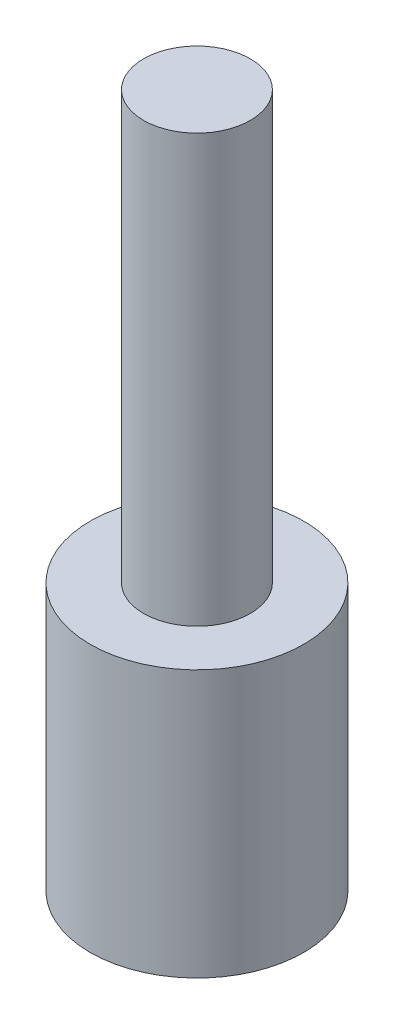
ISO-10303-21;
HEADER;
FILE_DESCRIPTION(('STEP AP214'),'2;1');
FILE_NAME('part.step','',(''),(''),'','','');
FILE_SCHEMA(('AUTOMOTIVE_DESIGN { 1 0 10303 214 1 1 1 1 }'));
ENDSEC;
DATA;
#1=APPLICATION_CONTEXT('core data for automotive mechanical design processes');
#2=APPLICATION_PROTOCOL_DEFINITION('international standard','automotive_design',2000,#1);
#3=PRODUCT_CONTEXT('',#1,'mechanical');
#4=PRODUCT('Part','Part','',(#3));
#5=PRODUCT_RELATED_PRODUCT_CATEGORY('part','',(#4));
#6=PRODUCT_DEFINITION_FORMATION('','',#4);
#7=PRODUCT_DEFINITION_CONTEXT('part definition',#1,'design');
#8=PRODUCT_DEFINITION('design','',#6,#7);
#9=PRODUCT_DEFINITION_SHAPE('','',#8);
#10=(LENGTH_UNIT() NAMED_UNIT(*) SI_UNIT(.MILLI.,.METRE.));
#11=(NAMED_UNIT(*) PLANE_ANGLE_UNIT() SI_UNIT($,.RADIAN.));
#12=(NAMED_UNIT(*) SI_UNIT($,.STERADIAN.) SOLID_ANGLE_UNIT());
#13=UNCERTAINTY_MEASURE_WITH_UNIT(LENGTH_MEASURE(1.E-05),#10,'distance_accuracy_value','');
#14=(GEOMETRIC_REPRESENTATION_CONTEXT(3) GLOBAL_UNCERTAINTY_ASSIGNED_CONTEXT((#13)) GLOBAL_UNIT_ASSIGNED_CONTEXT((#10,
#11,#12)) REPRESENTATION_CONTEXT('',''));
#15=CARTESIAN_POINT('',(0.,0.,0.));
#16=DIRECTION('',(0.,0.,1.));
#17=DIRECTION('',(1.,0.,0.));
#18=AXIS2_PLACEMENT_3D('',#15,#16,#17);
#19=CARTESIAN_POINT('',(0.,50.,0.));
#20=DIRECTION('',(0.,-1.,0.));
#21=DIRECTION('',(0.,0.,-1.));
#22=AXIS2_PLACEMENT_3D('',#19,#20,#21);
#23=CYLINDRICAL_SURFACE('',#22,20.);
#24=CARTESIAN_POINT('',(0.,50.,0.));
#25=DIRECTION('',(0.,1.,0.));
#26=DIRECTION('',(0.,0.,1.));
#27=AXIS2_PLACEMENT_3D('',#24,#25,#26);
#28=CIRCLE('',#27,20.);
#29=CARTESIAN_POINT('',(0.,50.,20.));
#30=VERTEX_POINT('',#29);
#31=EDGE_CURVE('E10',#30,#30,#28,.T.);
#32=ORIENTED_EDGE('',*,*,#31,.F.);
#33=EDGE_LOOP('',(#32));
#34=FACE_BOUND('',#33,.T.);
#35=CARTESIAN_POINT('',(0.,0.,0.));
#36=DIRECTION('',(0.,1.,0.));
#37=DIRECTION('',(0.,0.,1.));
#38=AXIS2_PLACEMENT_3D('',#35,#36,#37);
#39=CIRCLE('',#38,20.);
#40=CARTESIAN_POINT('',(0.,0.,20.));
#41=VERTEX_POINT('',#40);
#42=EDGE_CURVE('E34',#41,#41,#39,.T.);
#43=ORIENTED_EDGE('',*,*,#42,.T.);
#44=EDGE_LOOP('',(#43));
#45=FACE_BOUND('',#44,.T.);
#46=ADVANCED_FACE('F31',(#34,#45),#23,.T.);
#47=CARTESIAN_POINT('',(0.,50.,0.));
#48=DIRECTION('',(0.,1.,0.));
#49=DIRECTION('',(0.,0.,1.));
#50=AXIS2_PLACEMENT_3D('',#47,#48,#49);
#51=PLANE('',#50);
#52=CARTESIAN_POINT('',(0.,50.,0.));
#53=DIRECTION('',(0.,1.,0.));
#54=DIRECTION('',(0.,0.,1.));
#55=AXIS2_PLACEMENT_3D('',#52,#53,#54);
#56=CIRCLE('',#55,10.);
#57=CARTESIAN_POINT('',(0.,50.,10.));
#58=VERTEX_POINT('',#57);
#59=EDGE_CURVE('E43',#58,#58,#56,.T.);
#60=ORIENTED_EDGE('',*,*,#59,.F.);
#61=EDGE_LOOP('',(#60));
#62=FACE_BOUND('',#61,.T.);
#63=ORIENTED_EDGE('',*,*,#31,.T.);
#64=EDGE_LOOP('',(#63));
#65=FACE_BOUND('',#64,.T.);
#66=ADVANCED_FACE('F58',(#62,#65),#51,.T.);
#67=CARTESIAN_POINT('',(0.,0.,0.));
#68=DIRECTION('',(0.,1.,0.));
#69=DIRECTION('',(0.,0.,1.));
#70=AXIS2_PLACEMENT_3D('',#67,#68,#69);
#71=PLANE('',#70);
#72=ORIENTED_EDGE('',*,*,#42,.F.);
#73=EDGE_LOOP('',(#72));
#74=FACE_BOUND('',#73,.T.);
#75=ADVANCED_FACE('F54',(#74),#71,.F.);
#76=CARTESIAN_POINT('',(0.,130.,0.));
#77=DIRECTION('',(0.,-1.,0.));
#78=DIRECTION('',(0.,0.,-1.));
#79=AXIS2_PLACEMENT_3D('',#76,#77,#78);
#80=CYLINDRICAL_SURFACE('',#79,10.);
#81=CARTESIAN_POINT('',(0.,130.,0.));
#82=DIRECTION('',(0.,1.,0.));
#83=DIRECTION('',(0.,0.,1.));
#84=AXIS2_PLACEMENT_3D('',#81,#82,#83);
#85=CIRCLE('',#84,10.);
#86=CARTESIAN_POINT('',(0.,130.,10.));
#87=VERTEX_POINT('',#86);
#88=EDGE_CURVE('E41',#87,#87,#85,.T.);
#89=ORIENTED_EDGE('',*,*,#88,.F.);
#90=EDGE_LOOP('',(#89));
#91=FACE_BOUND('',#90,.T.);
#92=ORIENTED_EDGE('',*,*,#59,.T.);
#93=EDGE_LOOP('',(#92));
#94=FACE_BOUND('',#93,.T.);
#95=ADVANCED_FACE('F51',(#91,#94),#80,.T.);
#96=CARTESIAN_POINT('',(0.,130.,0.));
#97=DIRECTION('',(0.,1.,0.));
#98=DIRECTION('',(0.,0.,1.));
#99=AXIS2_PLACEMENT_3D('',#96,#97,#98);
#100=PLANE('',#99);
#101=ORIENTED_EDGE('',*,*,#88,.T.);
#102=EDGE_LOOP('',(#101));
#103=FACE_BOUND('',#102,.T.);
#104=ADVANCED_FACE('F49',(#103),#100,.T.);
#105=CLOSED_SHELL('',(#46,#66,#75,#95,#104));
#106=MANIFOLD_SOLID_BREP('B2',#105);
#107=ADVANCED_BREP_SHAPE_REPRESENTATION('',(#18,#106),#14);
#108=SHAPE_DEFINITION_REPRESENTATION(#9,#107);
ENDSEC;
END-ISO-10303-21;
